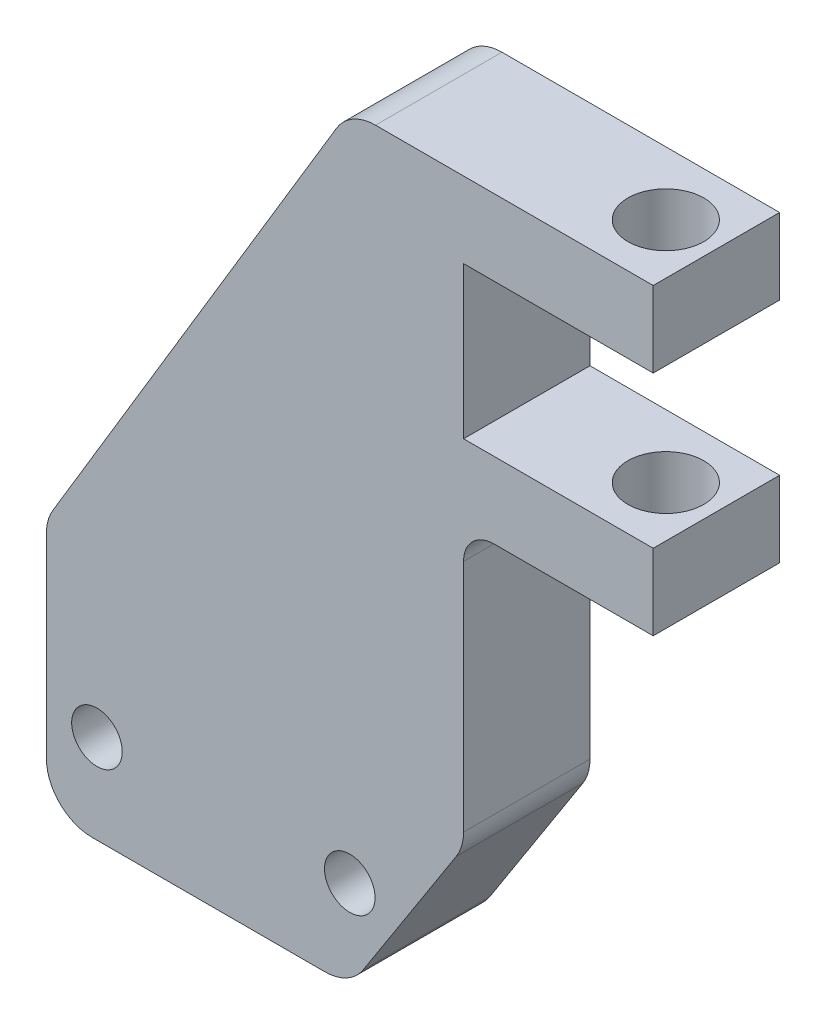
ISO-10303-21;
HEADER;
FILE_DESCRIPTION(('STEP AP214'),'2;1');
FILE_NAME('part.step','',(''),(''),'','','');
FILE_SCHEMA(('AUTOMOTIVE_DESIGN { 1 0 10303 214 1 1 1 1 }'));
ENDSEC;
DATA;
#1=APPLICATION_CONTEXT('core data for automotive mechanical design processes');
#2=APPLICATION_PROTOCOL_DEFINITION('international standard','automotive_design',2000,#1);
#3=PRODUCT_CONTEXT('',#1,'mechanical');
#4=PRODUCT('Part','Part','',(#3));
#5=PRODUCT_RELATED_PRODUCT_CATEGORY('part','',(#4));
#6=PRODUCT_DEFINITION_FORMATION('','',#4);
#7=PRODUCT_DEFINITION_CONTEXT('part definition',#1,'design');
#8=PRODUCT_DEFINITION('design','',#6,#7);
#9=PRODUCT_DEFINITION_SHAPE('','',#8);
#10=(LENGTH_UNIT() NAMED_UNIT(*) SI_UNIT(.MILLI.,.METRE.));
#11=(NAMED_UNIT(*) PLANE_ANGLE_UNIT() SI_UNIT($,.RADIAN.));
#12=(NAMED_UNIT(*) SI_UNIT($,.STERADIAN.) SOLID_ANGLE_UNIT());
#13=UNCERTAINTY_MEASURE_WITH_UNIT(LENGTH_MEASURE(1.E-05),#10,'distance_accuracy_value','');
#14=(GEOMETRIC_REPRESENTATION_CONTEXT(3) GLOBAL_UNCERTAINTY_ASSIGNED_CONTEXT((#13)) GLOBAL_UNIT_ASSIGNED_CONTEXT((#10,
#11,#12)) REPRESENTATION_CONTEXT('',''));
#15=CARTESIAN_POINT('',(0.,0.,0.));
#16=DIRECTION('',(0.,0.,1.));
#17=DIRECTION('',(1.,0.,0.));
#18=AXIS2_PLACEMENT_3D('',#15,#16,#17);
#19=CARTESIAN_POINT('',(7.03861821086262,6.2132587859425,5.));
#20=DIRECTION('',(0.,0.,-1.));
#21=DIRECTION('',(-1.,0.,0.));
#22=AXIS2_PLACEMENT_3D('',#19,#20,#21);
#23=PLANE('',#22);
#24=CARTESIAN_POINT('',(9.0386182108626,9.73823799583506,5.));
#25=DIRECTION('',(0.,0.,1.));
#26=DIRECTION('',(1.,0.,0.));
#27=AXIS2_PLACEMENT_3D('',#24,#25,#26);
#28=CIRCLE('',#27,1.);
#29=CARTESIAN_POINT('',(10.0386182108626,9.73823799583506,5.));
#30=VERTEX_POINT('',#29);
#31=EDGE_CURVE('E205',#30,#30,#28,.T.);
#32=ORIENTED_EDGE('',*,*,#31,.F.);
#33=EDGE_LOOP('',(#32));
#34=FACE_BOUND('',#33,.T.);
#35=DIRECTION('',(-1.,0.,0.));
#36=VECTOR('',#35,1.);
#37=CARTESIAN_POINT('',(19.0386182108626,36.2132587859425,5.));
#38=LINE('',#37,#36);
#39=CARTESIAN_POINT('',(31.0386182108626,36.2132587859425,5.));
#40=VERTEX_POINT('',#39);
#41=CARTESIAN_POINT('',(20.0577608930069,36.2132587859425,5.));
#42=VERTEX_POINT('',#41);
#43=EDGE_CURVE('E192',#40,#42,#38,.T.);
#44=ORIENTED_EDGE('',*,*,#43,.T.);
#45=CARTESIAN_POINT('',(20.0577608930069,34.4132587859425,5.));
#46=DIRECTION('',(0.,0.,-1.));
#47=DIRECTION('',(-1.,0.,0.));
#48=AXIS2_PLACEMENT_3D('',#45,#46,#47);
#49=CIRCLE('',#48,1.8);
#50=CARTESIAN_POINT('',(18.5142736267243,35.339351145712,5.));
#51=VERTEX_POINT('',#50);
#52=EDGE_CURVE('E267',#42,#51,#49,.F.);
#53=ORIENTED_EDGE('',*,*,#52,.T.);
#54=DIRECTION('',(-0.514495755427526,-0.857492925712545,0.));
#55=VECTOR('',#54,1.);
#56=CARTESIAN_POINT('',(7.03861821086262,16.2132587859425,5.));
#57=LINE('',#56,#55);
#58=CARTESIAN_POINT('',(7.29513094458004,16.6407800088049,5.));
#59=VERTEX_POINT('',#58);
#60=EDGE_CURVE('E194',#51,#59,#57,.T.);
#61=ORIENTED_EDGE('',*,*,#60,.T.);
#62=CARTESIAN_POINT('',(8.83861821086261,15.7146876490353,5.));
#63=DIRECTION('',(0.,0.,-1.));
#64=DIRECTION('',(-1.,0.,0.));
#65=AXIS2_PLACEMENT_3D('',#62,#63,#64);
#66=CIRCLE('',#65,1.8);
#67=CARTESIAN_POINT('',(7.03861821086262,15.7146876490353,5.));
#68=VERTEX_POINT('',#67);
#69=EDGE_CURVE('E265',#59,#68,#66,.F.);
#70=ORIENTED_EDGE('',*,*,#69,.T.);
#71=DIRECTION('',(0.,-1.,0.));
#72=VECTOR('',#71,1.);
#73=CARTESIAN_POINT('',(7.03861821086262,6.2132587859425,5.));
#74=LINE('',#73,#72);
#75=CARTESIAN_POINT('',(7.03861821086262,8.0132587859425,5.));
#76=VERTEX_POINT('',#75);
#77=EDGE_CURVE('E197',#68,#76,#74,.T.);
#78=ORIENTED_EDGE('',*,*,#77,.T.);
#79=CARTESIAN_POINT('',(8.83861821086261,8.0132587859425,5.));
#80=DIRECTION('',(0.,0.,-1.));
#81=DIRECTION('',(-1.,0.,0.));
#82=AXIS2_PLACEMENT_3D('',#79,#80,#81);
#83=CIRCLE('',#82,1.8);
#84=CARTESIAN_POINT('',(8.83861821086261,6.2132587859425,5.));
#85=VERTEX_POINT('',#84);
#86=EDGE_CURVE('E259',#76,#85,#83,.F.);
#87=ORIENTED_EDGE('',*,*,#86,.T.);
#88=DIRECTION('',(1.,0.,0.));
#89=VECTOR('',#88,1.);
#90=CARTESIAN_POINT('',(19.0386182108626,6.2132587859425,5.));
#91=LINE('',#90,#89);
#92=CARTESIAN_POINT('',(18.0559060280935,6.2132587859425,5.));
#93=VERTEX_POINT('',#92);
#94=EDGE_CURVE('E230',#85,#93,#91,.T.);
#95=ORIENTED_EDGE('',*,*,#94,.T.);
#96=CARTESIAN_POINT('',(18.0559060280935,8.0132587859425,5.));
#97=DIRECTION('',(0.,0.,-1.));
#98=DIRECTION('',(-1.,0.,0.));
#99=AXIS2_PLACEMENT_3D('',#96,#97,#98);
#100=CIRCLE('',#99,1.8);
#101=CARTESIAN_POINT('',(19.5700272837713,7.0398951215782,5.));
#102=VERTEX_POINT('',#101);
#103=EDGE_CURVE('E261',#93,#102,#100,.F.);
#104=ORIENTED_EDGE('',*,*,#103,.T.);
#105=DIRECTION('',(0.540757591313499,0.841178475376553,0.));
#106=VECTOR('',#105,1.);
#107=CARTESIAN_POINT('',(23.5386182108626,13.2132587859425,5.));
#108=LINE('',#107,#106);
#109=CARTESIAN_POINT('',(23.2527394665404,12.7685585169968,5.));
#110=VERTEX_POINT('',#109);
#111=EDGE_CURVE('E353',#102,#110,#108,.T.);
#112=ORIENTED_EDGE('',*,*,#111,.T.);
#113=CARTESIAN_POINT('',(21.7386182108626,13.7419221813611,5.));
#114=DIRECTION('',(0.,0.,-1.));
#115=DIRECTION('',(-1.,0.,0.));
#116=AXIS2_PLACEMENT_3D('',#113,#114,#115);
#117=CIRCLE('',#116,1.8);
#118=CARTESIAN_POINT('',(23.5386182108626,13.7419221813611,5.));
#119=VERTEX_POINT('',#118);
#120=EDGE_CURVE('E263',#110,#119,#117,.F.);
#121=ORIENTED_EDGE('',*,*,#120,.T.);
#122=DIRECTION('',(0.,1.,0.));
#123=VECTOR('',#122,1.);
#124=CARTESIAN_POINT('',(23.5386182108626,24.2132587859425,5.));
#125=LINE('',#124,#123);
#126=CARTESIAN_POINT('',(23.5386182108626,23.0132587859425,5.));
#127=VERTEX_POINT('',#126);
#128=EDGE_CURVE('E167',#119,#127,#125,.T.);
#129=ORIENTED_EDGE('',*,*,#128,.T.);
#130=CARTESIAN_POINT('',(24.7386182108626,23.0132587859425,5.));
#131=DIRECTION('',(0.,0.,-1.));
#132=DIRECTION('',(-1.,0.,0.));
#133=AXIS2_PLACEMENT_3D('',#130,#131,#132);
#134=CIRCLE('',#133,1.2);
#135=CARTESIAN_POINT('',(24.7386182108626,24.2132587859425,5.));
#136=VERTEX_POINT('',#135);
#137=EDGE_CURVE('E11',#127,#136,#134,.T.);
#138=ORIENTED_EDGE('',*,*,#137,.T.);
#139=DIRECTION('',(1.,0.,0.));
#140=VECTOR('',#139,1.);
#141=CARTESIAN_POINT('',(31.0386182108626,24.2132587859425,5.));
#142=LINE('',#141,#140);
#143=CARTESIAN_POINT('',(31.0386182108626,24.2132587859425,5.));
#144=VERTEX_POINT('',#143);
#145=EDGE_CURVE('E156',#136,#144,#142,.T.);
#146=ORIENTED_EDGE('',*,*,#145,.T.);
#147=DIRECTION('',(0.,1.,0.));
#148=VECTOR('',#147,1.);
#149=CARTESIAN_POINT('',(31.0386182108626,27.2132587859425,5.));
#150=LINE('',#149,#148);
#151=CARTESIAN_POINT('',(31.0386182108626,27.2132587859425,5.));
#152=VERTEX_POINT('',#151);
#153=EDGE_CURVE('E161',#144,#152,#150,.T.);
#154=ORIENTED_EDGE('',*,*,#153,.T.);
#155=DIRECTION('',(-1.,0.,0.));
#156=VECTOR('',#155,1.);
#157=CARTESIAN_POINT('',(23.5386182108626,27.2132587859425,5.));
#158=LINE('',#157,#156);
#159=CARTESIAN_POINT('',(23.5386182108626,27.2132587859425,5.));
#160=VERTEX_POINT('',#159);
#161=EDGE_CURVE('E181',#152,#160,#158,.T.);
#162=ORIENTED_EDGE('',*,*,#161,.T.);
#163=DIRECTION('',(0.,1.,0.));
#164=VECTOR('',#163,1.);
#165=CARTESIAN_POINT('',(23.5386182108626,33.2132587859425,5.));
#166=LINE('',#165,#164);
#167=CARTESIAN_POINT('',(23.5386182108626,33.2132587859425,5.));
#168=VERTEX_POINT('',#167);
#169=EDGE_CURVE('E183',#160,#168,#166,.T.);
#170=ORIENTED_EDGE('',*,*,#169,.T.);
#171=DIRECTION('',(1.,0.,0.));
#172=VECTOR('',#171,1.);
#173=CARTESIAN_POINT('',(31.0386182108626,33.2132587859425,5.));
#174=LINE('',#173,#172);
#175=CARTESIAN_POINT('',(31.0386182108626,33.2132587859425,5.));
#176=VERTEX_POINT('',#175);
#177=EDGE_CURVE('E188',#168,#176,#174,.T.);
#178=ORIENTED_EDGE('',*,*,#177,.T.);
#179=DIRECTION('',(0.,1.,0.));
#180=VECTOR('',#179,1.);
#181=CARTESIAN_POINT('',(31.0386182108626,36.2132587859425,5.));
#182=LINE('',#181,#180);
#183=EDGE_CURVE('E190',#176,#40,#182,.T.);
#184=ORIENTED_EDGE('',*,*,#183,.T.);
#185=EDGE_LOOP('',(#44,#53,#61,#70,#78,#87,#95,#104,#112,#121,#129,#138,#146,#154,#162,#170,
#178,#184));
#186=FACE_BOUND('',#185,.T.);
#187=CARTESIAN_POINT('',(19.0386182108626,9.73823799583506,5.));
#188=DIRECTION('',(0.,0.,1.));
#189=DIRECTION('',(1.,0.,0.));
#190=AXIS2_PLACEMENT_3D('',#187,#188,#189);
#191=CIRCLE('',#190,1.);
#192=CARTESIAN_POINT('',(20.0386182108626,9.73823799583506,5.));
#193=VERTEX_POINT('',#192);
#194=EDGE_CURVE('E361',#193,#193,#191,.T.);
#195=ORIENTED_EDGE('',*,*,#194,.F.);
#196=EDGE_LOOP('',(#195));
#197=FACE_BOUND('',#196,.T.);
#198=ADVANCED_FACE('F32',(#34,#186,#197),#23,.F.);
#199=CARTESIAN_POINT('',(7.03861821086262,6.2132587859425,0.));
#200=DIRECTION('',(0.,0.,-1.));
#201=DIRECTION('',(-1.,0.,0.));
#202=AXIS2_PLACEMENT_3D('',#199,#200,#201);
#203=PLANE('',#202);
#204=CARTESIAN_POINT('',(9.0386182108626,9.73823799583506,0.));
#205=DIRECTION('',(0.,0.,1.));
#206=DIRECTION('',(1.,0.,0.));
#207=AXIS2_PLACEMENT_3D('',#204,#205,#206);
#208=CIRCLE('',#207,1.);
#209=CARTESIAN_POINT('',(10.0386182108626,9.73823799583506,0.));
#210=VERTEX_POINT('',#209);
#211=EDGE_CURVE('E358',#210,#210,#208,.T.);
#212=ORIENTED_EDGE('',*,*,#211,.T.);
#213=EDGE_LOOP('',(#212));
#214=FACE_BOUND('',#213,.T.);
#215=DIRECTION('',(-0.514495755427526,-0.857492925712545,0.));
#216=VECTOR('',#215,1.);
#217=CARTESIAN_POINT('',(7.03861821086262,16.2132587859425,0.));
#218=LINE('',#217,#216);
#219=CARTESIAN_POINT('',(18.5142736267243,35.339351145712,0.));
#220=VERTEX_POINT('',#219);
#221=CARTESIAN_POINT('',(7.29513094458004,16.6407800088049,0.));
#222=VERTEX_POINT('',#221);
#223=EDGE_CURVE('E224',#220,#222,#218,.T.);
#224=ORIENTED_EDGE('',*,*,#223,.F.);
#225=CARTESIAN_POINT('',(20.0577608930069,34.4132587859425,0.));
#226=DIRECTION('',(0.,0.,-1.));
#227=DIRECTION('',(-1.,0.,0.));
#228=AXIS2_PLACEMENT_3D('',#225,#226,#227);
#229=CIRCLE('',#228,1.8);
#230=CARTESIAN_POINT('',(20.0577608930069,36.2132587859425,0.));
#231=VERTEX_POINT('',#230);
#232=EDGE_CURVE('E255',#220,#231,#229,.T.);
#233=ORIENTED_EDGE('',*,*,#232,.T.);
#234=DIRECTION('',(-1.,0.,0.));
#235=VECTOR('',#234,1.);
#236=CARTESIAN_POINT('',(19.0386182108626,36.2132587859425,0.));
#237=LINE('',#236,#235);
#238=CARTESIAN_POINT('',(31.0386182108626,36.2132587859425,0.));
#239=VERTEX_POINT('',#238);
#240=EDGE_CURVE('E221',#239,#231,#237,.T.);
#241=ORIENTED_EDGE('',*,*,#240,.F.);
#242=DIRECTION('',(0.,1.,0.));
#243=VECTOR('',#242,1.);
#244=CARTESIAN_POINT('',(31.0386182108626,36.2132587859425,0.));
#245=LINE('',#244,#243);
#246=CARTESIAN_POINT('',(31.0386182108626,33.2132587859425,0.));
#247=VERTEX_POINT('',#246);
#248=EDGE_CURVE('E219',#247,#239,#245,.T.);
#249=ORIENTED_EDGE('',*,*,#248,.F.);
#250=DIRECTION('',(1.,0.,0.));
#251=VECTOR('',#250,1.);
#252=CARTESIAN_POINT('',(31.0386182108626,33.2132587859425,0.));
#253=LINE('',#252,#251);
#254=CARTESIAN_POINT('',(23.5386182108626,33.2132587859425,0.));
#255=VERTEX_POINT('',#254);
#256=EDGE_CURVE('E217',#255,#247,#253,.T.);
#257=ORIENTED_EDGE('',*,*,#256,.F.);
#258=DIRECTION('',(0.,1.,0.));
#259=VECTOR('',#258,1.);
#260=CARTESIAN_POINT('',(23.5386182108626,33.2132587859425,0.));
#261=LINE('',#260,#259);
#262=CARTESIAN_POINT('',(23.5386182108626,27.2132587859425,0.));
#263=VERTEX_POINT('',#262);
#264=EDGE_CURVE('E215',#263,#255,#261,.T.);
#265=ORIENTED_EDGE('',*,*,#264,.F.);
#266=DIRECTION('',(-1.,0.,0.));
#267=VECTOR('',#266,1.);
#268=CARTESIAN_POINT('',(23.5386182108626,27.2132587859425,0.));
#269=LINE('',#268,#267);
#270=CARTESIAN_POINT('',(31.0386182108626,27.2132587859425,0.));
#271=VERTEX_POINT('',#270);
#272=EDGE_CURVE('E213',#271,#263,#269,.T.);
#273=ORIENTED_EDGE('',*,*,#272,.F.);
#274=DIRECTION('',(0.,1.,0.));
#275=VECTOR('',#274,1.);
#276=CARTESIAN_POINT('',(31.0386182108626,27.2132587859425,0.));
#277=LINE('',#276,#275);
#278=CARTESIAN_POINT('',(31.0386182108626,24.2132587859425,0.));
#279=VERTEX_POINT('',#278);
#280=EDGE_CURVE('E211',#279,#271,#277,.T.);
#281=ORIENTED_EDGE('',*,*,#280,.F.);
#282=DIRECTION('',(1.,0.,0.));
#283=VECTOR('',#282,1.);
#284=CARTESIAN_POINT('',(31.0386182108626,24.2132587859425,0.));
#285=LINE('',#284,#283);
#286=CARTESIAN_POINT('',(24.7386182108626,24.2132587859425,0.));
#287=VERTEX_POINT('',#286);
#288=EDGE_CURVE('E172',#287,#279,#285,.T.);
#289=ORIENTED_EDGE('',*,*,#288,.F.);
#290=CARTESIAN_POINT('',(24.7386182108626,23.0132587859425,0.));
#291=DIRECTION('',(0.,0.,-1.));
#292=DIRECTION('',(-1.,0.,0.));
#293=AXIS2_PLACEMENT_3D('',#290,#291,#292);
#294=CIRCLE('',#293,1.2);
#295=CARTESIAN_POINT('',(23.5386182108626,23.0132587859425,0.));
#296=VERTEX_POINT('',#295);
#297=EDGE_CURVE('E40',#287,#296,#294,.F.);
#298=ORIENTED_EDGE('',*,*,#297,.T.);
#299=DIRECTION('',(0.,1.,0.));
#300=VECTOR('',#299,1.);
#301=CARTESIAN_POINT('',(23.5386182108626,24.2132587859425,0.));
#302=LINE('',#301,#300);
#303=CARTESIAN_POINT('',(23.5386182108626,13.7419221813611,0.));
#304=VERTEX_POINT('',#303);
#305=EDGE_CURVE('E208',#304,#296,#302,.T.);
#306=ORIENTED_EDGE('',*,*,#305,.F.);
#307=CARTESIAN_POINT('',(21.7386182108626,13.7419221813611,0.));
#308=DIRECTION('',(0.,0.,-1.));
#309=DIRECTION('',(-1.,0.,0.));
#310=AXIS2_PLACEMENT_3D('',#307,#308,#309);
#311=CIRCLE('',#310,1.8);
#312=CARTESIAN_POINT('',(23.2527394665404,12.7685585169968,0.));
#313=VERTEX_POINT('',#312);
#314=EDGE_CURVE('E251',#304,#313,#311,.T.);
#315=ORIENTED_EDGE('',*,*,#314,.T.);
#316=DIRECTION('',(0.540757591313499,0.841178475376553,0.));
#317=VECTOR('',#316,1.);
#318=CARTESIAN_POINT('',(23.5386182108626,13.2132587859425,0.));
#319=LINE('',#318,#317);
#320=CARTESIAN_POINT('',(19.5700272837713,7.0398951215782,0.));
#321=VERTEX_POINT('',#320);
#322=EDGE_CURVE('E204',#321,#313,#319,.T.);
#323=ORIENTED_EDGE('',*,*,#322,.F.);
#324=CARTESIAN_POINT('',(18.0559060280935,8.0132587859425,0.));
#325=DIRECTION('',(0.,0.,-1.));
#326=DIRECTION('',(-1.,0.,0.));
#327=AXIS2_PLACEMENT_3D('',#324,#325,#326);
#328=CIRCLE('',#327,1.8);
#329=CARTESIAN_POINT('',(18.0559060280935,6.2132587859425,0.));
#330=VERTEX_POINT('',#329);
#331=EDGE_CURVE('E249',#321,#330,#328,.T.);
#332=ORIENTED_EDGE('',*,*,#331,.T.);
#333=DIRECTION('',(1.,0.,0.));
#334=VECTOR('',#333,1.);
#335=CARTESIAN_POINT('',(19.0386182108626,6.2132587859425,0.));
#336=LINE('',#335,#334);
#337=CARTESIAN_POINT('',(8.83861821086261,6.2132587859425,0.));
#338=VERTEX_POINT('',#337);
#339=EDGE_CURVE('E201',#338,#330,#336,.T.);
#340=ORIENTED_EDGE('',*,*,#339,.F.);
#341=CARTESIAN_POINT('',(8.83861821086261,8.0132587859425,0.));
#342=DIRECTION('',(0.,0.,-1.));
#343=DIRECTION('',(-1.,0.,0.));
#344=AXIS2_PLACEMENT_3D('',#341,#342,#343);
#345=CIRCLE('',#344,1.8);
#346=CARTESIAN_POINT('',(7.03861821086262,8.0132587859425,0.));
#347=VERTEX_POINT('',#346);
#348=EDGE_CURVE('E247',#338,#347,#345,.T.);
#349=ORIENTED_EDGE('',*,*,#348,.T.);
#350=DIRECTION('',(0.,-1.,0.));
#351=VECTOR('',#350,1.);
#352=CARTESIAN_POINT('',(7.03861821086262,6.2132587859425,0.));
#353=LINE('',#352,#351);
#354=CARTESIAN_POINT('',(7.03861821086262,15.7146876490353,0.));
#355=VERTEX_POINT('',#354);
#356=EDGE_CURVE('E227',#355,#347,#353,.T.);
#357=ORIENTED_EDGE('',*,*,#356,.F.);
#358=CARTESIAN_POINT('',(8.83861821086261,15.7146876490353,0.));
#359=DIRECTION('',(0.,0.,-1.));
#360=DIRECTION('',(-1.,0.,0.));
#361=AXIS2_PLACEMENT_3D('',#358,#359,#360);
#362=CIRCLE('',#361,1.8);
#363=EDGE_CURVE('E253',#355,#222,#362,.T.);
#364=ORIENTED_EDGE('',*,*,#363,.T.);
#365=EDGE_LOOP('',(#224,#233,#241,#249,#257,#265,#273,#281,#289,#298,#306,#315,#323,#332,#340,
#349,#357,#364));
#366=FACE_BOUND('',#365,.T.);
#367=CARTESIAN_POINT('',(19.0386182108626,9.73823799583506,0.));
#368=DIRECTION('',(0.,0.,1.));
#369=DIRECTION('',(1.,0.,0.));
#370=AXIS2_PLACEMENT_3D('',#367,#368,#369);
#371=CIRCLE('',#370,1.);
#372=CARTESIAN_POINT('',(20.0386182108626,9.73823799583506,0.));
#373=VERTEX_POINT('',#372);
#374=EDGE_CURVE('E364',#373,#373,#371,.T.);
#375=ORIENTED_EDGE('',*,*,#374,.T.);
#376=EDGE_LOOP('',(#375));
#377=FACE_BOUND('',#376,.T.);
#378=ADVANCED_FACE('F291',(#214,#366,#377),#203,.T.);
#379=CARTESIAN_POINT('',(19.0386182108626,6.2132587859425,5.));
#380=DIRECTION('',(0.,1.,0.));
#381=DIRECTION('',(-1.,0.,0.));
#382=AXIS2_PLACEMENT_3D('',#379,#380,#381);
#383=PLANE('',#382);
#384=ORIENTED_EDGE('',*,*,#339,.T.);
#385=DIRECTION('',(0.,0.,-1.));
#386=VECTOR('',#385,1.);
#387=CARTESIAN_POINT('',(18.0559060280935,6.2132587859425,5.));
#388=LINE('',#387,#386);
#389=EDGE_CURVE('E285',#330,#93,#388,.F.);
#390=ORIENTED_EDGE('',*,*,#389,.T.);
#391=ORIENTED_EDGE('',*,*,#94,.F.);
#392=DIRECTION('',(0.,0.,-1.));
#393=VECTOR('',#392,1.);
#394=CARTESIAN_POINT('',(8.83861821086261,6.2132587859425,5.));
#395=LINE('',#394,#393);
#396=EDGE_CURVE('E282',#85,#338,#395,.T.);
#397=ORIENTED_EDGE('',*,*,#396,.T.);
#398=EDGE_LOOP('',(#384,#390,#391,#397));
#399=FACE_BOUND('',#398,.T.);
#400=ADVANCED_FACE('F341',(#399),#383,.F.);
#401=CARTESIAN_POINT('',(23.5386182108626,13.2132587859425,5.));
#402=DIRECTION('',(-0.841178475376553,0.540757591313499,0.));
#403=DIRECTION('',(-0.540757591313499,-0.841178475376553,0.));
#404=AXIS2_PLACEMENT_3D('',#401,#402,#403);
#405=PLANE('',#404);
#406=ORIENTED_EDGE('',*,*,#322,.T.);
#407=DIRECTION('',(0.,0.,-1.));
#408=VECTOR('',#407,1.);
#409=CARTESIAN_POINT('',(23.2527394665404,12.7685585169968,5.));
#410=LINE('',#409,#408);
#411=EDGE_CURVE('E280',#313,#110,#410,.F.);
#412=ORIENTED_EDGE('',*,*,#411,.T.);
#413=ORIENTED_EDGE('',*,*,#111,.F.);
#414=DIRECTION('',(0.,0.,-1.));
#415=VECTOR('',#414,1.);
#416=CARTESIAN_POINT('',(19.5700272837713,7.0398951215782,5.));
#417=LINE('',#416,#415);
#418=EDGE_CURVE('E277',#102,#321,#417,.T.);
#419=ORIENTED_EDGE('',*,*,#418,.T.);
#420=EDGE_LOOP('',(#406,#412,#413,#419));
#421=FACE_BOUND('',#420,.T.);
#422=ADVANCED_FACE('F350',(#421),#405,.F.);
#423=CARTESIAN_POINT('',(23.5386182108626,24.2132587859425,5.));
#424=DIRECTION('',(-1.,0.,0.));
#425=DIRECTION('',(0.,-1.,0.));
#426=AXIS2_PLACEMENT_3D('',#423,#424,#425);
#427=PLANE('',#426);
#428=ORIENTED_EDGE('',*,*,#305,.T.);
#429=DIRECTION('',(0.,0.,-1.));
#430=VECTOR('',#429,1.);
#431=CARTESIAN_POINT('',(23.5386182108626,23.0132587859425,5.));
#432=LINE('',#431,#430);
#433=EDGE_CURVE('E53',#296,#127,#432,.F.);
#434=ORIENTED_EDGE('',*,*,#433,.T.);
#435=ORIENTED_EDGE('',*,*,#128,.F.);
#436=DIRECTION('',(0.,0.,-1.));
#437=VECTOR('',#436,1.);
#438=CARTESIAN_POINT('',(23.5386182108626,13.7419221813611,5.));
#439=LINE('',#438,#437);
#440=EDGE_CURVE('E274',#119,#304,#439,.T.);
#441=ORIENTED_EDGE('',*,*,#440,.T.);
#442=EDGE_LOOP('',(#428,#434,#435,#441));
#443=FACE_BOUND('',#442,.T.);
#444=ADVANCED_FACE('F436',(#443),#427,.F.);
#445=CARTESIAN_POINT('',(31.0386182108626,24.2132587859425,5.));
#446=DIRECTION('',(0.,1.,0.));
#447=DIRECTION('',(-1.,0.,0.));
#448=AXIS2_PLACEMENT_3D('',#445,#446,#447);
#449=PLANE('',#448);
#450=CARTESIAN_POINT('',(29.0386182108626,24.2132587859425,2.5));
#451=DIRECTION('',(0.,1.,0.));
#452=DIRECTION('',(-1.,0.,0.));
#453=AXIS2_PLACEMENT_3D('',#450,#451,#452);
#454=CIRCLE('',#453,1.5);
#455=CARTESIAN_POINT('',(27.5386182108626,24.2132587859425,2.5));
#456=VERTEX_POINT('',#455);
#457=EDGE_CURVE('E367',#456,#456,#454,.T.);
#458=ORIENTED_EDGE('',*,*,#457,.T.);
#459=EDGE_LOOP('',(#458));
#460=FACE_BOUND('',#459,.T.);
#461=ORIENTED_EDGE('',*,*,#145,.F.);
#462=DIRECTION('',(0.,0.,-1.));
#463=VECTOR('',#462,1.);
#464=CARTESIAN_POINT('',(24.7386182108626,24.2132587859425,0.));
#465=LINE('',#464,#463);
#466=EDGE_CURVE('E287',#136,#287,#465,.T.);
#467=ORIENTED_EDGE('',*,*,#466,.T.);
#468=ORIENTED_EDGE('',*,*,#288,.T.);
#469=DIRECTION('',(0.,0.,-1.));
#470=VECTOR('',#469,1.);
#471=CARTESIAN_POINT('',(31.0386182108626,24.2132587859425,5.));
#472=LINE('',#471,#470);
#473=EDGE_CURVE('E170',#144,#279,#472,.T.);
#474=ORIENTED_EDGE('',*,*,#473,.F.);
#475=EDGE_LOOP('',(#461,#467,#468,#474));
#476=FACE_BOUND('',#475,.T.);
#477=ADVANCED_FACE('F171',(#460,#476),#449,.F.);
#478=CARTESIAN_POINT('',(31.0386182108626,27.2132587859425,5.));
#479=DIRECTION('',(-1.,0.,0.));
#480=DIRECTION('',(0.,0.,1.));
#481=AXIS2_PLACEMENT_3D('',#478,#479,#480);
#482=PLANE('',#481);
#483=ORIENTED_EDGE('',*,*,#280,.T.);
#484=DIRECTION('',(0.,0.,-1.));
#485=VECTOR('',#484,1.);
#486=CARTESIAN_POINT('',(31.0386182108626,27.2132587859425,5.));
#487=LINE('',#486,#485);
#488=EDGE_CURVE('E176',#152,#271,#487,.T.);
#489=ORIENTED_EDGE('',*,*,#488,.F.);
#490=ORIENTED_EDGE('',*,*,#153,.F.);
#491=ORIENTED_EDGE('',*,*,#473,.T.);
#492=EDGE_LOOP('',(#483,#489,#490,#491));
#493=FACE_BOUND('',#492,.T.);
#494=ADVANCED_FACE('F178',(#493),#482,.F.);
#495=CARTESIAN_POINT('',(23.5386182108626,27.2132587859425,5.));
#496=DIRECTION('',(0.,-1.,0.));
#497=DIRECTION('',(0.,0.,-1.));
#498=AXIS2_PLACEMENT_3D('',#495,#496,#497);
#499=PLANE('',#498);
#500=CARTESIAN_POINT('',(29.0386182108626,27.2132587859425,2.5));
#501=DIRECTION('',(0.,-1.,0.));
#502=DIRECTION('',(0.,0.,-1.));
#503=AXIS2_PLACEMENT_3D('',#500,#501,#502);
#504=CIRCLE('',#503,1.5);
#505=CARTESIAN_POINT('',(29.0386182108626,27.2132587859425,0.999999999999999));
#506=VERTEX_POINT('',#505);
#507=EDGE_CURVE('E372',#506,#506,#504,.T.);
#508=ORIENTED_EDGE('',*,*,#507,.T.);
#509=EDGE_LOOP('',(#508));
#510=FACE_BOUND('',#509,.T.);
#511=ORIENTED_EDGE('',*,*,#272,.T.);
#512=DIRECTION('',(0.,0.,-1.));
#513=VECTOR('',#512,1.);
#514=CARTESIAN_POINT('',(23.5386182108626,27.2132587859425,5.));
#515=LINE('',#514,#513);
#516=EDGE_CURVE('E239',#160,#263,#515,.T.);
#517=ORIENTED_EDGE('',*,*,#516,.F.);
#518=ORIENTED_EDGE('',*,*,#161,.F.);
#519=ORIENTED_EDGE('',*,*,#488,.T.);
#520=EDGE_LOOP('',(#511,#517,#518,#519));
#521=FACE_BOUND('',#520,.T.);
#522=ADVANCED_FACE('F296',(#510,#521),#499,.F.);
#523=CARTESIAN_POINT('',(23.5386182108626,33.2132587859425,5.));
#524=DIRECTION('',(-1.,0.,0.));
#525=DIRECTION('',(0.,-1.,0.));
#526=AXIS2_PLACEMENT_3D('',#523,#524,#525);
#527=PLANE('',#526);
#528=ORIENTED_EDGE('',*,*,#264,.T.);
#529=DIRECTION('',(0.,0.,-1.));
#530=VECTOR('',#529,1.);
#531=CARTESIAN_POINT('',(23.5386182108626,33.2132587859425,5.));
#532=LINE('',#531,#530);
#533=EDGE_CURVE('E236',#168,#255,#532,.T.);
#534=ORIENTED_EDGE('',*,*,#533,.F.);
#535=ORIENTED_EDGE('',*,*,#169,.F.);
#536=ORIENTED_EDGE('',*,*,#516,.T.);
#537=EDGE_LOOP('',(#528,#534,#535,#536));
#538=FACE_BOUND('',#537,.T.);
#539=ADVANCED_FACE('F303',(#538),#527,.F.);
#540=CARTESIAN_POINT('',(31.0386182108626,33.2132587859425,5.));
#541=DIRECTION('',(0.,1.,0.));
#542=DIRECTION('',(-1.,0.,0.));
#543=AXIS2_PLACEMENT_3D('',#540,#541,#542);
#544=PLANE('',#543);
#545=CARTESIAN_POINT('',(29.0386182108626,33.2132587859425,2.5));
#546=DIRECTION('',(0.,1.,0.));
#547=DIRECTION('',(-1.,0.,0.));
#548=AXIS2_PLACEMENT_3D('',#545,#546,#547);
#549=CIRCLE('',#548,1.5);
#550=CARTESIAN_POINT('',(27.5386182108626,33.2132587859425,2.5));
#551=VERTEX_POINT('',#550);
#552=EDGE_CURVE('E375',#551,#551,#549,.T.);
#553=ORIENTED_EDGE('',*,*,#552,.T.);
#554=EDGE_LOOP('',(#553));
#555=FACE_BOUND('',#554,.T.);
#556=ORIENTED_EDGE('',*,*,#256,.T.);
#557=DIRECTION('',(0.,0.,-1.));
#558=VECTOR('',#557,1.);
#559=CARTESIAN_POINT('',(31.0386182108626,33.2132587859425,5.));
#560=LINE('',#559,#558);
#561=EDGE_CURVE('E233',#176,#247,#560,.T.);
#562=ORIENTED_EDGE('',*,*,#561,.F.);
#563=ORIENTED_EDGE('',*,*,#177,.F.);
#564=ORIENTED_EDGE('',*,*,#533,.T.);
#565=EDGE_LOOP('',(#556,#562,#563,#564));
#566=FACE_BOUND('',#565,.T.);
#567=ADVANCED_FACE('F306',(#555,#566),#544,.F.);
#568=CARTESIAN_POINT('',(31.0386182108626,36.2132587859425,5.));
#569=DIRECTION('',(-1.,0.,0.));
#570=DIRECTION('',(0.,0.,1.));
#571=AXIS2_PLACEMENT_3D('',#568,#569,#570);
#572=PLANE('',#571);
#573=ORIENTED_EDGE('',*,*,#248,.T.);
#574=DIRECTION('',(0.,0.,-1.));
#575=VECTOR('',#574,1.);
#576=CARTESIAN_POINT('',(31.0386182108626,36.2132587859425,5.));
#577=LINE('',#576,#575);
#578=EDGE_CURVE('E200',#40,#239,#577,.T.);
#579=ORIENTED_EDGE('',*,*,#578,.F.);
#580=ORIENTED_EDGE('',*,*,#183,.F.);
#581=ORIENTED_EDGE('',*,*,#561,.T.);
#582=EDGE_LOOP('',(#573,#579,#580,#581));
#583=FACE_BOUND('',#582,.T.);
#584=ADVANCED_FACE('F311',(#583),#572,.F.);
#585=CARTESIAN_POINT('',(19.0386182108626,36.2132587859425,5.));
#586=DIRECTION('',(0.,-1.,0.));
#587=DIRECTION('',(1.,0.,0.));
#588=AXIS2_PLACEMENT_3D('',#585,#586,#587);
#589=PLANE('',#588);
#590=CARTESIAN_POINT('',(29.0386182108626,36.2132587859425,2.5));
#591=DIRECTION('',(0.,1.,0.));
#592=DIRECTION('',(-1.,0.,0.));
#593=AXIS2_PLACEMENT_3D('',#590,#591,#592);
#594=CIRCLE('',#593,1.5);
#595=CARTESIAN_POINT('',(27.5386182108626,36.2132587859425,2.5));
#596=VERTEX_POINT('',#595);
#597=EDGE_CURVE('E378',#596,#596,#594,.T.);
#598=ORIENTED_EDGE('',*,*,#597,.F.);
#599=EDGE_LOOP('',(#598));
#600=FACE_BOUND('',#599,.T.);
#601=ORIENTED_EDGE('',*,*,#240,.T.);
#602=DIRECTION('',(0.,0.,-1.));
#603=VECTOR('',#602,1.);
#604=CARTESIAN_POINT('',(20.0577608930069,36.2132587859425,5.));
#605=LINE('',#604,#603);
#606=EDGE_CURVE('E257',#231,#42,#605,.F.);
#607=ORIENTED_EDGE('',*,*,#606,.T.);
#608=ORIENTED_EDGE('',*,*,#43,.F.);
#609=ORIENTED_EDGE('',*,*,#578,.T.);
#610=EDGE_LOOP('',(#601,#607,#608,#609));
#611=FACE_BOUND('',#610,.T.);
#612=ADVANCED_FACE('F385',(#600,#611),#589,.F.);
#613=CARTESIAN_POINT('',(7.03861821086262,16.2132587859425,5.));
#614=DIRECTION('',(0.857492925712545,-0.514495755427526,0.));
#615=DIRECTION('',(0.514495755427526,0.857492925712545,0.));
#616=AXIS2_PLACEMENT_3D('',#613,#614,#615);
#617=PLANE('',#616);
#618=ORIENTED_EDGE('',*,*,#60,.F.);
#619=DIRECTION('',(0.,0.,-1.));
#620=VECTOR('',#619,1.);
#621=CARTESIAN_POINT('',(18.5142736267243,35.339351145712,5.));
#622=LINE('',#621,#620);
#623=EDGE_CURVE('E244',#51,#220,#622,.T.);
#624=ORIENTED_EDGE('',*,*,#623,.T.);
#625=ORIENTED_EDGE('',*,*,#223,.T.);
#626=DIRECTION('',(0.,0.,-1.));
#627=VECTOR('',#626,1.);
#628=CARTESIAN_POINT('',(7.29513094458004,16.6407800088049,5.));
#629=LINE('',#628,#627);
#630=EDGE_CURVE('E175',#222,#59,#629,.F.);
#631=ORIENTED_EDGE('',*,*,#630,.T.);
#632=EDGE_LOOP('',(#618,#624,#625,#631));
#633=FACE_BOUND('',#632,.T.);
#634=ADVANCED_FACE('F321',(#633),#617,.F.);
#635=CARTESIAN_POINT('',(7.03861821086262,6.2132587859425,5.));
#636=DIRECTION('',(1.,0.,0.));
#637=DIRECTION('',(0.,0.,-1.));
#638=AXIS2_PLACEMENT_3D('',#635,#636,#637);
#639=PLANE('',#638);
#640=ORIENTED_EDGE('',*,*,#77,.F.);
#641=DIRECTION('',(0.,0.,-1.));
#642=VECTOR('',#641,1.);
#643=CARTESIAN_POINT('',(7.03861821086262,15.7146876490353,5.));
#644=LINE('',#643,#642);
#645=EDGE_CURVE('E271',#68,#355,#644,.T.);
#646=ORIENTED_EDGE('',*,*,#645,.T.);
#647=ORIENTED_EDGE('',*,*,#356,.T.);
#648=DIRECTION('',(0.,0.,-1.));
#649=VECTOR('',#648,1.);
#650=CARTESIAN_POINT('',(7.03861821086262,8.0132587859425,5.));
#651=LINE('',#650,#649);
#652=EDGE_CURVE('E269',#347,#76,#651,.F.);
#653=ORIENTED_EDGE('',*,*,#652,.T.);
#654=EDGE_LOOP('',(#640,#646,#647,#653));
#655=FACE_BOUND('',#654,.T.);
#656=ADVANCED_FACE('F331',(#655),#639,.F.);
#657=CARTESIAN_POINT('',(9.0386182108626,9.73823799583506,5.));
#658=DIRECTION('',(0.,0.,-1.));
#659=DIRECTION('',(-1.,0.,0.));
#660=AXIS2_PLACEMENT_3D('',#657,#658,#659);
#661=CYLINDRICAL_SURFACE('',#660,1.);
#662=ORIENTED_EDGE('',*,*,#31,.T.);
#663=EDGE_LOOP('',(#662));
#664=FACE_BOUND('',#663,.T.);
#665=ORIENTED_EDGE('',*,*,#211,.F.);
#666=EDGE_LOOP('',(#665));
#667=FACE_BOUND('',#666,.T.);
#668=ADVANCED_FACE('F404',(#664,#667),#661,.F.);
#669=CARTESIAN_POINT('',(19.0386182108626,9.73823799583506,5.));
#670=DIRECTION('',(0.,0.,-1.));
#671=DIRECTION('',(-1.,0.,0.));
#672=AXIS2_PLACEMENT_3D('',#669,#670,#671);
#673=CYLINDRICAL_SURFACE('',#672,1.);
#674=ORIENTED_EDGE('',*,*,#194,.T.);
#675=EDGE_LOOP('',(#674));
#676=FACE_BOUND('',#675,.T.);
#677=ORIENTED_EDGE('',*,*,#374,.F.);
#678=EDGE_LOOP('',(#677));
#679=FACE_BOUND('',#678,.T.);
#680=ADVANCED_FACE('F411',(#676,#679),#673,.F.);
#681=CARTESIAN_POINT('',(20.0577608930069,34.4132587859425,5.));
#682=DIRECTION('',(0.,0.,-1.));
#683=DIRECTION('',(-1.,0.,0.));
#684=AXIS2_PLACEMENT_3D('',#681,#682,#683);
#685=CYLINDRICAL_SURFACE('',#684,1.8);
#686=ORIENTED_EDGE('',*,*,#52,.F.);
#687=ORIENTED_EDGE('',*,*,#606,.F.);
#688=ORIENTED_EDGE('',*,*,#232,.F.);
#689=ORIENTED_EDGE('',*,*,#623,.F.);
#690=EDGE_LOOP('',(#686,#687,#688,#689));
#691=FACE_BOUND('',#690,.T.);
#692=ADVANCED_FACE('F319',(#691),#685,.T.);
#693=CARTESIAN_POINT('',(8.83861821086261,15.7146876490353,5.));
#694=DIRECTION('',(0.,0.,-1.));
#695=DIRECTION('',(-1.,0.,0.));
#696=AXIS2_PLACEMENT_3D('',#693,#694,#695);
#697=CYLINDRICAL_SURFACE('',#696,1.8);
#698=ORIENTED_EDGE('',*,*,#69,.F.);
#699=ORIENTED_EDGE('',*,*,#630,.F.);
#700=ORIENTED_EDGE('',*,*,#363,.F.);
#701=ORIENTED_EDGE('',*,*,#645,.F.);
#702=EDGE_LOOP('',(#698,#699,#700,#701));
#703=FACE_BOUND('',#702,.T.);
#704=ADVANCED_FACE('F328',(#703),#697,.T.);
#705=CARTESIAN_POINT('',(21.7386182108626,13.7419221813611,5.));
#706=DIRECTION('',(0.,0.,-1.));
#707=DIRECTION('',(-1.,0.,0.));
#708=AXIS2_PLACEMENT_3D('',#705,#706,#707);
#709=CYLINDRICAL_SURFACE('',#708,1.8);
#710=ORIENTED_EDGE('',*,*,#120,.F.);
#711=ORIENTED_EDGE('',*,*,#411,.F.);
#712=ORIENTED_EDGE('',*,*,#314,.F.);
#713=ORIENTED_EDGE('',*,*,#440,.F.);
#714=EDGE_LOOP('',(#710,#711,#712,#713));
#715=FACE_BOUND('',#714,.T.);
#716=ADVANCED_FACE('F452',(#715),#709,.T.);
#717=CARTESIAN_POINT('',(18.0559060280935,8.0132587859425,5.));
#718=DIRECTION('',(0.,0.,-1.));
#719=DIRECTION('',(-1.,0.,0.));
#720=AXIS2_PLACEMENT_3D('',#717,#718,#719);
#721=CYLINDRICAL_SURFACE('',#720,1.8);
#722=ORIENTED_EDGE('',*,*,#103,.F.);
#723=ORIENTED_EDGE('',*,*,#389,.F.);
#724=ORIENTED_EDGE('',*,*,#331,.F.);
#725=ORIENTED_EDGE('',*,*,#418,.F.);
#726=EDGE_LOOP('',(#722,#723,#724,#725));
#727=FACE_BOUND('',#726,.T.);
#728=ADVANCED_FACE('F347',(#727),#721,.T.);
#729=CARTESIAN_POINT('',(8.83861821086261,8.0132587859425,5.));
#730=DIRECTION('',(0.,0.,-1.));
#731=DIRECTION('',(-1.,0.,0.));
#732=AXIS2_PLACEMENT_3D('',#729,#730,#731);
#733=CYLINDRICAL_SURFACE('',#732,1.8);
#734=ORIENTED_EDGE('',*,*,#86,.F.);
#735=ORIENTED_EDGE('',*,*,#652,.F.);
#736=ORIENTED_EDGE('',*,*,#348,.F.);
#737=ORIENTED_EDGE('',*,*,#396,.F.);
#738=EDGE_LOOP('',(#734,#735,#736,#737));
#739=FACE_BOUND('',#738,.T.);
#740=ADVANCED_FACE('F338',(#739),#733,.T.);
#741=CARTESIAN_POINT('',(24.7386182108626,23.0132587859425,5.));
#742=DIRECTION('',(0.,0.,1.));
#743=DIRECTION('',(1.,0.,0.));
#744=AXIS2_PLACEMENT_3D('',#741,#742,#743);
#745=CYLINDRICAL_SURFACE('',#744,1.2);
#746=ORIENTED_EDGE('',*,*,#137,.F.);
#747=ORIENTED_EDGE('',*,*,#433,.F.);
#748=ORIENTED_EDGE('',*,*,#297,.F.);
#749=ORIENTED_EDGE('',*,*,#466,.F.);
#750=EDGE_LOOP('',(#746,#747,#748,#749));
#751=FACE_BOUND('',#750,.T.);
#752=ADVANCED_FACE('F34',(#751),#745,.F.);
#753=CARTESIAN_POINT('',(29.0386182108626,19.2132587859425,2.5));
#754=DIRECTION('',(0.,1.,0.));
#755=DIRECTION('',(-1.,0.,0.));
#756=AXIS2_PLACEMENT_3D('',#753,#754,#755);
#757=CYLINDRICAL_SURFACE('',#756,1.5);
#758=ORIENTED_EDGE('',*,*,#597,.T.);
#759=EDGE_LOOP('',(#758));
#760=FACE_BOUND('',#759,.T.);
#761=ORIENTED_EDGE('',*,*,#552,.F.);
#762=EDGE_LOOP('',(#761));
#763=FACE_BOUND('',#762,.T.);
#764=ADVANCED_FACE('F382',(#760,#763),#757,.F.);
#765=ORIENTED_EDGE('',*,*,#507,.F.);
#766=EDGE_LOOP('',(#765));
#767=FACE_BOUND('',#766,.T.);
#768=ORIENTED_EDGE('',*,*,#457,.F.);
#769=EDGE_LOOP('',(#768));
#770=FACE_BOUND('',#769,.T.);
#771=ADVANCED_FACE('F425',(#767,#770),#757,.F.);
#772=CLOSED_SHELL('',(#198,#378,#400,#422,#444,#477,#494,#522,#539,#567,#584,#612,#634,#656,
#668,#680,#692,#704,#716,#728,#740,#752,#764,#771));
#773=MANIFOLD_SOLID_BREP('B2',#772);
#774=ADVANCED_BREP_SHAPE_REPRESENTATION('',(#18,#773),#14);
#775=SHAPE_DEFINITION_REPRESENTATION(#9,#774);
ENDSEC;
END-ISO-10303-21;
